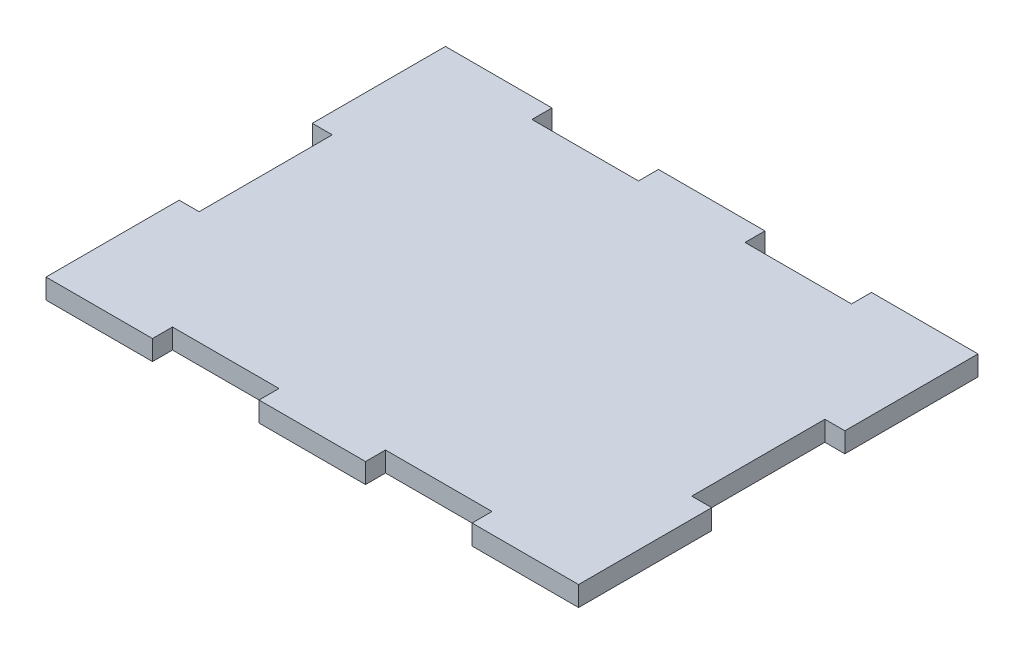
ISO-10303-21;
HEADER;
FILE_DESCRIPTION(('STEP AP214'),'2;1');
FILE_NAME('part.step','',(''),(''),'','','');
FILE_SCHEMA(('AUTOMOTIVE_DESIGN { 1 0 10303 214 1 1 1 1 }'));
ENDSEC;
DATA;
#1=APPLICATION_CONTEXT('core data for automotive mechanical design processes');
#2=APPLICATION_PROTOCOL_DEFINITION('international standard','automotive_design',2000,#1);
#3=PRODUCT_CONTEXT('',#1,'mechanical');
#4=PRODUCT('Part','Part','',(#3));
#5=PRODUCT_RELATED_PRODUCT_CATEGORY('part','',(#4));
#6=PRODUCT_DEFINITION_FORMATION('','',#4);
#7=PRODUCT_DEFINITION_CONTEXT('part definition',#1,'design');
#8=PRODUCT_DEFINITION('design','',#6,#7);
#9=PRODUCT_DEFINITION_SHAPE('','',#8);
#10=(LENGTH_UNIT() NAMED_UNIT(*) SI_UNIT(.MILLI.,.METRE.));
#11=(NAMED_UNIT(*) PLANE_ANGLE_UNIT() SI_UNIT($,.RADIAN.));
#12=(NAMED_UNIT(*) SI_UNIT($,.STERADIAN.) SOLID_ANGLE_UNIT());
#13=UNCERTAINTY_MEASURE_WITH_UNIT(LENGTH_MEASURE(1.E-05),#10,'distance_accuracy_value','');
#14=(GEOMETRIC_REPRESENTATION_CONTEXT(3) GLOBAL_UNCERTAINTY_ASSIGNED_CONTEXT((#13)) GLOBAL_UNIT_ASSIGNED_CONTEXT((#10,
#11,#12)) REPRESENTATION_CONTEXT('',''));
#15=CARTESIAN_POINT('',(0.,0.,0.));
#16=DIRECTION('',(0.,0.,1.));
#17=DIRECTION('',(1.,0.,0.));
#18=AXIS2_PLACEMENT_3D('',#15,#16,#17);
#19=CARTESIAN_POINT('',(0.,3.,0.));
#20=DIRECTION('',(1.,0.,0.));
#21=DIRECTION('',(0.,0.,-1.));
#22=AXIS2_PLACEMENT_3D('',#19,#20,#21);
#23=PLANE('',#22);
#24=DIRECTION('',(0.,0.,1.));
#25=VECTOR('',#24,1.);
#26=CARTESIAN_POINT('',(0.,0.,0.));
#27=LINE('',#26,#25);
#28=CARTESIAN_POINT('',(0.,0.,-20.));
#29=VERTEX_POINT('',#28);
#30=CARTESIAN_POINT('',(0.,0.,0.));
#31=VERTEX_POINT('',#30);
#32=EDGE_CURVE('E248',#29,#31,#27,.T.);
#33=ORIENTED_EDGE('',*,*,#32,.T.);
#34=DIRECTION('',(0.,-1.,0.));
#35=VECTOR('',#34,1.);
#36=CARTESIAN_POINT('',(0.,3.,0.));
#37=LINE('',#36,#35);
#38=CARTESIAN_POINT('',(0.,3.,0.));
#39=VERTEX_POINT('',#38);
#40=EDGE_CURVE('E11',#39,#31,#37,.T.);
#41=ORIENTED_EDGE('',*,*,#40,.F.);
#42=DIRECTION('',(0.,0.,1.));
#43=VECTOR('',#42,1.);
#44=CARTESIAN_POINT('',(0.,3.,0.));
#45=LINE('',#44,#43);
#46=CARTESIAN_POINT('',(0.,3.,-20.));
#47=VERTEX_POINT('',#46);
#48=EDGE_CURVE('E302',#47,#39,#45,.T.);
#49=ORIENTED_EDGE('',*,*,#48,.F.);
#50=DIRECTION('',(0.,-1.,0.));
#51=VECTOR('',#50,1.);
#52=CARTESIAN_POINT('',(0.,3.,-20.));
#53=LINE('',#52,#51);
#54=EDGE_CURVE('E244',#47,#29,#53,.T.);
#55=ORIENTED_EDGE('',*,*,#54,.T.);
#56=EDGE_LOOP('',(#33,#41,#49,#55));
#57=FACE_BOUND('',#56,.T.);
#58=ADVANCED_FACE('F32',(#57),#23,.F.);
#59=CARTESIAN_POINT('',(0.,3.,0.));
#60=DIRECTION('',(0.,0.,-1.));
#61=DIRECTION('',(-1.,0.,0.));
#62=AXIS2_PLACEMENT_3D('',#59,#60,#61);
#63=PLANE('',#62);
#64=DIRECTION('',(1.,0.,0.));
#65=VECTOR('',#64,1.);
#66=CARTESIAN_POINT('',(0.,0.,0.));
#67=LINE('',#66,#65);
#68=CARTESIAN_POINT('',(16.,0.,0.));
#69=VERTEX_POINT('',#68);
#70=EDGE_CURVE('E251',#31,#69,#67,.T.);
#71=ORIENTED_EDGE('',*,*,#70,.T.);
#72=DIRECTION('',(0.,-1.,0.));
#73=VECTOR('',#72,1.);
#74=CARTESIAN_POINT('',(16.,3.,0.));
#75=LINE('',#74,#73);
#76=CARTESIAN_POINT('',(16.,3.,0.));
#77=VERTEX_POINT('',#76);
#78=EDGE_CURVE('E40',#77,#69,#75,.T.);
#79=ORIENTED_EDGE('',*,*,#78,.F.);
#80=DIRECTION('',(1.,0.,0.));
#81=VECTOR('',#80,1.);
#82=CARTESIAN_POINT('',(0.,3.,0.));
#83=LINE('',#82,#81);
#84=EDGE_CURVE('E151',#39,#77,#83,.T.);
#85=ORIENTED_EDGE('',*,*,#84,.F.);
#86=ORIENTED_EDGE('',*,*,#40,.T.);
#87=EDGE_LOOP('',(#71,#79,#85,#86));
#88=FACE_BOUND('',#87,.T.);
#89=ADVANCED_FACE('F460',(#88),#63,.F.);
#90=CARTESIAN_POINT('',(16.,3.,0.));
#91=DIRECTION('',(-1.,0.,0.));
#92=DIRECTION('',(0.,0.,1.));
#93=AXIS2_PLACEMENT_3D('',#90,#91,#92);
#94=PLANE('',#93);
#95=DIRECTION('',(0.,0.,-1.));
#96=VECTOR('',#95,1.);
#97=CARTESIAN_POINT('',(16.,0.,0.));
#98=LINE('',#97,#96);
#99=CARTESIAN_POINT('',(16.,0.,-3.));
#100=VERTEX_POINT('',#99);
#101=EDGE_CURVE('E253',#69,#100,#98,.T.);
#102=ORIENTED_EDGE('',*,*,#101,.T.);
#103=DIRECTION('',(0.,-1.,0.));
#104=VECTOR('',#103,1.);
#105=CARTESIAN_POINT('',(16.,3.,-3.));
#106=LINE('',#105,#104);
#107=CARTESIAN_POINT('',(16.,3.,-3.));
#108=VERTEX_POINT('',#107);
#109=EDGE_CURVE('E369',#108,#100,#106,.T.);
#110=ORIENTED_EDGE('',*,*,#109,.F.);
#111=DIRECTION('',(0.,0.,-1.));
#112=VECTOR('',#111,1.);
#113=CARTESIAN_POINT('',(16.,3.,0.));
#114=LINE('',#113,#112);
#115=EDGE_CURVE('E377',#77,#108,#114,.T.);
#116=ORIENTED_EDGE('',*,*,#115,.F.);
#117=ORIENTED_EDGE('',*,*,#78,.T.);
#118=EDGE_LOOP('',(#102,#110,#116,#117));
#119=FACE_BOUND('',#118,.T.);
#120=ADVANCED_FACE('F375',(#119),#94,.F.);
#121=CARTESIAN_POINT('',(16.,3.,-3.));
#122=DIRECTION('',(0.,0.,-1.));
#123=DIRECTION('',(-1.,0.,0.));
#124=AXIS2_PLACEMENT_3D('',#121,#122,#123);
#125=PLANE('',#124);
#126=DIRECTION('',(1.,0.,0.));
#127=VECTOR('',#126,1.);
#128=CARTESIAN_POINT('',(16.,0.,-3.));
#129=LINE('',#128,#127);
#130=CARTESIAN_POINT('',(32.,0.,-3.));
#131=VERTEX_POINT('',#130);
#132=EDGE_CURVE('E255',#100,#131,#129,.T.);
#133=ORIENTED_EDGE('',*,*,#132,.T.);
#134=DIRECTION('',(0.,-1.,0.));
#135=VECTOR('',#134,1.);
#136=CARTESIAN_POINT('',(32.,3.,-3.));
#137=LINE('',#136,#135);
#138=CARTESIAN_POINT('',(32.,3.,-3.));
#139=VERTEX_POINT('',#138);
#140=EDGE_CURVE('E366',#139,#131,#137,.T.);
#141=ORIENTED_EDGE('',*,*,#140,.F.);
#142=DIRECTION('',(1.,0.,0.));
#143=VECTOR('',#142,1.);
#144=CARTESIAN_POINT('',(16.,3.,-3.));
#145=LINE('',#144,#143);
#146=EDGE_CURVE('E395',#108,#139,#145,.T.);
#147=ORIENTED_EDGE('',*,*,#146,.F.);
#148=ORIENTED_EDGE('',*,*,#109,.T.);
#149=EDGE_LOOP('',(#133,#141,#147,#148));
#150=FACE_BOUND('',#149,.T.);
#151=ADVANCED_FACE('F386',(#150),#125,.F.);
#152=CARTESIAN_POINT('',(32.,3.,0.));
#153=DIRECTION('',(1.,0.,0.));
#154=DIRECTION('',(0.,0.,-1.));
#155=AXIS2_PLACEMENT_3D('',#152,#153,#154);
#156=PLANE('',#155);
#157=DIRECTION('',(0.,0.,1.));
#158=VECTOR('',#157,1.);
#159=CARTESIAN_POINT('',(32.,0.,0.));
#160=LINE('',#159,#158);
#161=CARTESIAN_POINT('',(32.,0.,0.));
#162=VERTEX_POINT('',#161);
#163=EDGE_CURVE('E257',#131,#162,#160,.T.);
#164=ORIENTED_EDGE('',*,*,#163,.T.);
#165=DIRECTION('',(0.,-1.,0.));
#166=VECTOR('',#165,1.);
#167=CARTESIAN_POINT('',(32.,3.,0.));
#168=LINE('',#167,#166);
#169=CARTESIAN_POINT('',(32.,3.,0.));
#170=VERTEX_POINT('',#169);
#171=EDGE_CURVE('E363',#170,#162,#168,.T.);
#172=ORIENTED_EDGE('',*,*,#171,.F.);
#173=DIRECTION('',(0.,0.,1.));
#174=VECTOR('',#173,1.);
#175=CARTESIAN_POINT('',(32.,3.,0.));
#176=LINE('',#175,#174);
#177=EDGE_CURVE('E392',#139,#170,#176,.T.);
#178=ORIENTED_EDGE('',*,*,#177,.F.);
#179=ORIENTED_EDGE('',*,*,#140,.T.);
#180=EDGE_LOOP('',(#164,#172,#178,#179));
#181=FACE_BOUND('',#180,.T.);
#182=ADVANCED_FACE('F390',(#181),#156,.F.);
#183=CARTESIAN_POINT('',(32.,3.,0.));
#184=DIRECTION('',(0.,0.,-1.));
#185=DIRECTION('',(-1.,0.,0.));
#186=AXIS2_PLACEMENT_3D('',#183,#184,#185);
#187=PLANE('',#186);
#188=DIRECTION('',(1.,0.,0.));
#189=VECTOR('',#188,1.);
#190=CARTESIAN_POINT('',(32.,0.,0.));
#191=LINE('',#190,#189);
#192=CARTESIAN_POINT('',(48.,0.,0.));
#193=VERTEX_POINT('',#192);
#194=EDGE_CURVE('E259',#162,#193,#191,.T.);
#195=ORIENTED_EDGE('',*,*,#194,.T.);
#196=DIRECTION('',(0.,-1.,0.));
#197=VECTOR('',#196,1.);
#198=CARTESIAN_POINT('',(48.,3.,0.));
#199=LINE('',#198,#197);
#200=CARTESIAN_POINT('',(48.,3.,0.));
#201=VERTEX_POINT('',#200);
#202=EDGE_CURVE('E360',#201,#193,#199,.T.);
#203=ORIENTED_EDGE('',*,*,#202,.F.);
#204=DIRECTION('',(1.,0.,0.));
#205=VECTOR('',#204,1.);
#206=CARTESIAN_POINT('',(32.,3.,0.));
#207=LINE('',#206,#205);
#208=EDGE_CURVE('E394',#170,#201,#207,.T.);
#209=ORIENTED_EDGE('',*,*,#208,.F.);
#210=ORIENTED_EDGE('',*,*,#171,.T.);
#211=EDGE_LOOP('',(#195,#203,#209,#210));
#212=FACE_BOUND('',#211,.T.);
#213=ADVANCED_FACE('F473',(#212),#187,.F.);
#214=CARTESIAN_POINT('',(48.,3.,0.));
#215=DIRECTION('',(-1.,0.,0.));
#216=DIRECTION('',(0.,0.,1.));
#217=AXIS2_PLACEMENT_3D('',#214,#215,#216);
#218=PLANE('',#217);
#219=DIRECTION('',(0.,0.,-1.));
#220=VECTOR('',#219,1.);
#221=CARTESIAN_POINT('',(48.,0.,0.));
#222=LINE('',#221,#220);
#223=CARTESIAN_POINT('',(48.,0.,-3.));
#224=VERTEX_POINT('',#223);
#225=EDGE_CURVE('E261',#193,#224,#222,.T.);
#226=ORIENTED_EDGE('',*,*,#225,.T.);
#227=DIRECTION('',(0.,-1.,0.));
#228=VECTOR('',#227,1.);
#229=CARTESIAN_POINT('',(48.,3.,-3.));
#230=LINE('',#229,#228);
#231=CARTESIAN_POINT('',(48.,3.,-3.));
#232=VERTEX_POINT('',#231);
#233=EDGE_CURVE('E357',#232,#224,#230,.T.);
#234=ORIENTED_EDGE('',*,*,#233,.F.);
#235=DIRECTION('',(0.,0.,-1.));
#236=VECTOR('',#235,1.);
#237=CARTESIAN_POINT('',(48.,3.,0.));
#238=LINE('',#237,#236);
#239=EDGE_CURVE('E397',#201,#232,#238,.T.);
#240=ORIENTED_EDGE('',*,*,#239,.F.);
#241=ORIENTED_EDGE('',*,*,#202,.T.);
#242=EDGE_LOOP('',(#226,#234,#240,#241));
#243=FACE_BOUND('',#242,.T.);
#244=ADVANCED_FACE('F476',(#243),#218,.F.);
#245=CARTESIAN_POINT('',(48.,3.,-3.));
#246=DIRECTION('',(0.,0.,-1.));
#247=DIRECTION('',(-1.,0.,0.));
#248=AXIS2_PLACEMENT_3D('',#245,#246,#247);
#249=PLANE('',#248);
#250=DIRECTION('',(1.,0.,0.));
#251=VECTOR('',#250,1.);
#252=CARTESIAN_POINT('',(48.,0.,-3.));
#253=LINE('',#252,#251);
#254=CARTESIAN_POINT('',(64.,0.,-3.));
#255=VERTEX_POINT('',#254);
#256=EDGE_CURVE('E263',#224,#255,#253,.T.);
#257=ORIENTED_EDGE('',*,*,#256,.T.);
#258=DIRECTION('',(0.,-1.,0.));
#259=VECTOR('',#258,1.);
#260=CARTESIAN_POINT('',(64.,3.,-3.));
#261=LINE('',#260,#259);
#262=CARTESIAN_POINT('',(64.,3.,-3.));
#263=VERTEX_POINT('',#262);
#264=EDGE_CURVE('E354',#263,#255,#261,.T.);
#265=ORIENTED_EDGE('',*,*,#264,.F.);
#266=DIRECTION('',(1.,0.,0.));
#267=VECTOR('',#266,1.);
#268=CARTESIAN_POINT('',(48.,3.,-3.));
#269=LINE('',#268,#267);
#270=EDGE_CURVE('E403',#232,#263,#269,.T.);
#271=ORIENTED_EDGE('',*,*,#270,.F.);
#272=ORIENTED_EDGE('',*,*,#233,.T.);
#273=EDGE_LOOP('',(#257,#265,#271,#272));
#274=FACE_BOUND('',#273,.T.);
#275=ADVANCED_FACE('F480',(#274),#249,.F.);
#276=CARTESIAN_POINT('',(64.,3.,0.));
#277=DIRECTION('',(1.,0.,0.));
#278=DIRECTION('',(0.,0.,-1.));
#279=AXIS2_PLACEMENT_3D('',#276,#277,#278);
#280=PLANE('',#279);
#281=DIRECTION('',(0.,0.,1.));
#282=VECTOR('',#281,1.);
#283=CARTESIAN_POINT('',(64.,0.,0.));
#284=LINE('',#283,#282);
#285=CARTESIAN_POINT('',(64.,0.,0.));
#286=VERTEX_POINT('',#285);
#287=EDGE_CURVE('E265',#255,#286,#284,.T.);
#288=ORIENTED_EDGE('',*,*,#287,.T.);
#289=DIRECTION('',(0.,-1.,0.));
#290=VECTOR('',#289,1.);
#291=CARTESIAN_POINT('',(64.,3.,0.));
#292=LINE('',#291,#290);
#293=CARTESIAN_POINT('',(64.,3.,0.));
#294=VERTEX_POINT('',#293);
#295=EDGE_CURVE('E351',#294,#286,#292,.T.);
#296=ORIENTED_EDGE('',*,*,#295,.F.);
#297=DIRECTION('',(0.,0.,1.));
#298=VECTOR('',#297,1.);
#299=CARTESIAN_POINT('',(64.,3.,0.));
#300=LINE('',#299,#298);
#301=EDGE_CURVE('E405',#263,#294,#300,.T.);
#302=ORIENTED_EDGE('',*,*,#301,.F.);
#303=ORIENTED_EDGE('',*,*,#264,.T.);
#304=EDGE_LOOP('',(#288,#296,#302,#303));
#305=FACE_BOUND('',#304,.T.);
#306=ADVANCED_FACE('F484',(#305),#280,.F.);
#307=CARTESIAN_POINT('',(64.,3.,0.));
#308=DIRECTION('',(0.,0.,-1.));
#309=DIRECTION('',(-1.,0.,0.));
#310=AXIS2_PLACEMENT_3D('',#307,#308,#309);
#311=PLANE('',#310);
#312=DIRECTION('',(1.,0.,0.));
#313=VECTOR('',#312,1.);
#314=CARTESIAN_POINT('',(64.,0.,0.));
#315=LINE('',#314,#313);
#316=CARTESIAN_POINT('',(80.,0.,0.));
#317=VERTEX_POINT('',#316);
#318=EDGE_CURVE('E267',#286,#317,#315,.T.);
#319=ORIENTED_EDGE('',*,*,#318,.T.);
#320=DIRECTION('',(0.,-1.,0.));
#321=VECTOR('',#320,1.);
#322=CARTESIAN_POINT('',(80.,3.,0.));
#323=LINE('',#322,#321);
#324=CARTESIAN_POINT('',(80.,3.,0.));
#325=VERTEX_POINT('',#324);
#326=EDGE_CURVE('E348',#325,#317,#323,.T.);
#327=ORIENTED_EDGE('',*,*,#326,.F.);
#328=DIRECTION('',(1.,0.,0.));
#329=VECTOR('',#328,1.);
#330=CARTESIAN_POINT('',(64.,3.,0.));
#331=LINE('',#330,#329);
#332=EDGE_CURVE('E407',#294,#325,#331,.T.);
#333=ORIENTED_EDGE('',*,*,#332,.F.);
#334=ORIENTED_EDGE('',*,*,#295,.T.);
#335=EDGE_LOOP('',(#319,#327,#333,#334));
#336=FACE_BOUND('',#335,.T.);
#337=ADVANCED_FACE('F488',(#336),#311,.F.);
#338=CARTESIAN_POINT('',(80.,3.,0.));
#339=DIRECTION('',(-1.,0.,0.));
#340=DIRECTION('',(0.,0.,1.));
#341=AXIS2_PLACEMENT_3D('',#338,#339,#340);
#342=PLANE('',#341);
#343=DIRECTION('',(0.,0.,-1.));
#344=VECTOR('',#343,1.);
#345=CARTESIAN_POINT('',(80.,0.,0.));
#346=LINE('',#345,#344);
#347=CARTESIAN_POINT('',(80.,0.,-20.));
#348=VERTEX_POINT('',#347);
#349=EDGE_CURVE('E269',#317,#348,#346,.T.);
#350=ORIENTED_EDGE('',*,*,#349,.T.);
#351=DIRECTION('',(0.,-1.,0.));
#352=VECTOR('',#351,1.);
#353=CARTESIAN_POINT('',(80.,3.,-20.));
#354=LINE('',#353,#352);
#355=CARTESIAN_POINT('',(80.,3.,-20.));
#356=VERTEX_POINT('',#355);
#357=EDGE_CURVE('E345',#356,#348,#354,.T.);
#358=ORIENTED_EDGE('',*,*,#357,.F.);
#359=DIRECTION('',(0.,0.,-1.));
#360=VECTOR('',#359,1.);
#361=CARTESIAN_POINT('',(80.,3.,0.));
#362=LINE('',#361,#360);
#363=EDGE_CURVE('E409',#325,#356,#362,.T.);
#364=ORIENTED_EDGE('',*,*,#363,.F.);
#365=ORIENTED_EDGE('',*,*,#326,.T.);
#366=EDGE_LOOP('',(#350,#358,#364,#365));
#367=FACE_BOUND('',#366,.T.);
#368=ADVANCED_FACE('F492',(#367),#342,.F.);
#369=CARTESIAN_POINT('',(80.,3.,-20.));
#370=DIRECTION('',(0.,0.,1.));
#371=DIRECTION('',(1.,0.,0.));
#372=AXIS2_PLACEMENT_3D('',#369,#370,#371);
#373=PLANE('',#372);
#374=DIRECTION('',(-1.,0.,0.));
#375=VECTOR('',#374,1.);
#376=CARTESIAN_POINT('',(80.,0.,-20.));
#377=LINE('',#376,#375);
#378=CARTESIAN_POINT('',(77.,0.,-20.));
#379=VERTEX_POINT('',#378);
#380=EDGE_CURVE('E271',#348,#379,#377,.T.);
#381=ORIENTED_EDGE('',*,*,#380,.T.);
#382=DIRECTION('',(0.,-1.,0.));
#383=VECTOR('',#382,1.);
#384=CARTESIAN_POINT('',(77.,3.,-20.));
#385=LINE('',#384,#383);
#386=CARTESIAN_POINT('',(77.,3.,-20.));
#387=VERTEX_POINT('',#386);
#388=EDGE_CURVE('E342',#387,#379,#385,.T.);
#389=ORIENTED_EDGE('',*,*,#388,.F.);
#390=DIRECTION('',(-1.,0.,0.));
#391=VECTOR('',#390,1.);
#392=CARTESIAN_POINT('',(80.,3.,-20.));
#393=LINE('',#392,#391);
#394=EDGE_CURVE('E411',#356,#387,#393,.T.);
#395=ORIENTED_EDGE('',*,*,#394,.F.);
#396=ORIENTED_EDGE('',*,*,#357,.T.);
#397=EDGE_LOOP('',(#381,#389,#395,#396));
#398=FACE_BOUND('',#397,.T.);
#399=ADVANCED_FACE('F496',(#398),#373,.F.);
#400=CARTESIAN_POINT('',(77.,3.,-40.));
#401=DIRECTION('',(-1.,0.,0.));
#402=DIRECTION('',(0.,0.,1.));
#403=AXIS2_PLACEMENT_3D('',#400,#401,#402);
#404=PLANE('',#403);
#405=DIRECTION('',(0.,0.,-1.));
#406=VECTOR('',#405,1.);
#407=CARTESIAN_POINT('',(77.,0.,-40.));
#408=LINE('',#407,#406);
#409=CARTESIAN_POINT('',(77.,0.,-40.));
#410=VERTEX_POINT('',#409);
#411=EDGE_CURVE('E273',#379,#410,#408,.T.);
#412=ORIENTED_EDGE('',*,*,#411,.T.);
#413=DIRECTION('',(0.,-1.,0.));
#414=VECTOR('',#413,1.);
#415=CARTESIAN_POINT('',(77.,3.,-40.));
#416=LINE('',#415,#414);
#417=CARTESIAN_POINT('',(77.,3.,-40.));
#418=VERTEX_POINT('',#417);
#419=EDGE_CURVE('E339',#418,#410,#416,.T.);
#420=ORIENTED_EDGE('',*,*,#419,.F.);
#421=DIRECTION('',(0.,0.,-1.));
#422=VECTOR('',#421,1.);
#423=CARTESIAN_POINT('',(77.,3.,-40.));
#424=LINE('',#423,#422);
#425=EDGE_CURVE('E413',#387,#418,#424,.T.);
#426=ORIENTED_EDGE('',*,*,#425,.F.);
#427=ORIENTED_EDGE('',*,*,#388,.T.);
#428=EDGE_LOOP('',(#412,#420,#426,#427));
#429=FACE_BOUND('',#428,.T.);
#430=ADVANCED_FACE('F500',(#429),#404,.F.);
#431=CARTESIAN_POINT('',(80.,3.,-40.));
#432=DIRECTION('',(0.,0.,-1.));
#433=DIRECTION('',(-1.,0.,0.));
#434=AXIS2_PLACEMENT_3D('',#431,#432,#433);
#435=PLANE('',#434);
#436=DIRECTION('',(1.,0.,0.));
#437=VECTOR('',#436,1.);
#438=CARTESIAN_POINT('',(80.,0.,-40.));
#439=LINE('',#438,#437);
#440=CARTESIAN_POINT('',(80.,0.,-40.));
#441=VERTEX_POINT('',#440);
#442=EDGE_CURVE('E275',#410,#441,#439,.T.);
#443=ORIENTED_EDGE('',*,*,#442,.T.);
#444=DIRECTION('',(0.,-1.,0.));
#445=VECTOR('',#444,1.);
#446=CARTESIAN_POINT('',(80.,3.,-40.));
#447=LINE('',#446,#445);
#448=CARTESIAN_POINT('',(80.,3.,-40.));
#449=VERTEX_POINT('',#448);
#450=EDGE_CURVE('E336',#449,#441,#447,.T.);
#451=ORIENTED_EDGE('',*,*,#450,.F.);
#452=DIRECTION('',(1.,0.,0.));
#453=VECTOR('',#452,1.);
#454=CARTESIAN_POINT('',(80.,3.,-40.));
#455=LINE('',#454,#453);
#456=EDGE_CURVE('E415',#418,#449,#455,.T.);
#457=ORIENTED_EDGE('',*,*,#456,.F.);
#458=ORIENTED_EDGE('',*,*,#419,.T.);
#459=EDGE_LOOP('',(#443,#451,#457,#458));
#460=FACE_BOUND('',#459,.T.);
#461=ADVANCED_FACE('F504',(#460),#435,.F.);
#462=CARTESIAN_POINT('',(80.,3.,-40.));
#463=DIRECTION('',(-1.,0.,0.));
#464=DIRECTION('',(0.,0.,1.));
#465=AXIS2_PLACEMENT_3D('',#462,#463,#464);
#466=PLANE('',#465);
#467=DIRECTION('',(0.,0.,-1.));
#468=VECTOR('',#467,1.);
#469=CARTESIAN_POINT('',(80.,0.,-40.));
#470=LINE('',#469,#468);
#471=CARTESIAN_POINT('',(80.,0.,-60.));
#472=VERTEX_POINT('',#471);
#473=EDGE_CURVE('E277',#441,#472,#470,.T.);
#474=ORIENTED_EDGE('',*,*,#473,.T.);
#475=DIRECTION('',(0.,-1.,0.));
#476=VECTOR('',#475,1.);
#477=CARTESIAN_POINT('',(80.,3.,-60.));
#478=LINE('',#477,#476);
#479=CARTESIAN_POINT('',(80.,3.,-60.));
#480=VERTEX_POINT('',#479);
#481=EDGE_CURVE('E333',#480,#472,#478,.T.);
#482=ORIENTED_EDGE('',*,*,#481,.F.);
#483=DIRECTION('',(0.,0.,-1.));
#484=VECTOR('',#483,1.);
#485=CARTESIAN_POINT('',(80.,3.,-40.));
#486=LINE('',#485,#484);
#487=EDGE_CURVE('E417',#449,#480,#486,.T.);
#488=ORIENTED_EDGE('',*,*,#487,.F.);
#489=ORIENTED_EDGE('',*,*,#450,.T.);
#490=EDGE_LOOP('',(#474,#482,#488,#489));
#491=FACE_BOUND('',#490,.T.);
#492=ADVANCED_FACE('F508',(#491),#466,.F.);
#493=CARTESIAN_POINT('',(64.,3.,-60.));
#494=DIRECTION('',(0.,0.,1.));
#495=DIRECTION('',(1.,0.,0.));
#496=AXIS2_PLACEMENT_3D('',#493,#494,#495);
#497=PLANE('',#496);
#498=DIRECTION('',(-1.,0.,0.));
#499=VECTOR('',#498,1.);
#500=CARTESIAN_POINT('',(64.,0.,-60.));
#501=LINE('',#500,#499);
#502=CARTESIAN_POINT('',(64.,0.,-60.));
#503=VERTEX_POINT('',#502);
#504=EDGE_CURVE('E279',#472,#503,#501,.T.);
#505=ORIENTED_EDGE('',*,*,#504,.T.);
#506=DIRECTION('',(0.,-1.,0.));
#507=VECTOR('',#506,1.);
#508=CARTESIAN_POINT('',(64.,3.,-60.));
#509=LINE('',#508,#507);
#510=CARTESIAN_POINT('',(64.,3.,-60.));
#511=VERTEX_POINT('',#510);
#512=EDGE_CURVE('E330',#511,#503,#509,.T.);
#513=ORIENTED_EDGE('',*,*,#512,.F.);
#514=DIRECTION('',(-1.,0.,0.));
#515=VECTOR('',#514,1.);
#516=CARTESIAN_POINT('',(64.,3.,-60.));
#517=LINE('',#516,#515);
#518=EDGE_CURVE('E419',#480,#511,#517,.T.);
#519=ORIENTED_EDGE('',*,*,#518,.F.);
#520=ORIENTED_EDGE('',*,*,#481,.T.);
#521=EDGE_LOOP('',(#505,#513,#519,#520));
#522=FACE_BOUND('',#521,.T.);
#523=ADVANCED_FACE('F512',(#522),#497,.F.);
#524=CARTESIAN_POINT('',(64.,3.,-60.));
#525=DIRECTION('',(1.,0.,0.));
#526=DIRECTION('',(0.,0.,-1.));
#527=AXIS2_PLACEMENT_3D('',#524,#525,#526);
#528=PLANE('',#527);
#529=DIRECTION('',(0.,0.,1.));
#530=VECTOR('',#529,1.);
#531=CARTESIAN_POINT('',(64.,0.,-60.));
#532=LINE('',#531,#530);
#533=CARTESIAN_POINT('',(64.,0.,-57.));
#534=VERTEX_POINT('',#533);
#535=EDGE_CURVE('E281',#503,#534,#532,.T.);
#536=ORIENTED_EDGE('',*,*,#535,.T.);
#537=DIRECTION('',(0.,-1.,0.));
#538=VECTOR('',#537,1.);
#539=CARTESIAN_POINT('',(64.,3.,-57.));
#540=LINE('',#539,#538);
#541=CARTESIAN_POINT('',(64.,3.,-57.));
#542=VERTEX_POINT('',#541);
#543=EDGE_CURVE('E327',#542,#534,#540,.T.);
#544=ORIENTED_EDGE('',*,*,#543,.F.);
#545=DIRECTION('',(0.,0.,1.));
#546=VECTOR('',#545,1.);
#547=CARTESIAN_POINT('',(64.,3.,-60.));
#548=LINE('',#547,#546);
#549=EDGE_CURVE('E421',#511,#542,#548,.T.);
#550=ORIENTED_EDGE('',*,*,#549,.F.);
#551=ORIENTED_EDGE('',*,*,#512,.T.);
#552=EDGE_LOOP('',(#536,#544,#550,#551));
#553=FACE_BOUND('',#552,.T.);
#554=ADVANCED_FACE('F516',(#553),#528,.F.);
#555=CARTESIAN_POINT('',(48.,3.,-57.));
#556=DIRECTION('',(0.,0.,1.));
#557=DIRECTION('',(1.,0.,0.));
#558=AXIS2_PLACEMENT_3D('',#555,#556,#557);
#559=PLANE('',#558);
#560=DIRECTION('',(-1.,0.,0.));
#561=VECTOR('',#560,1.);
#562=CARTESIAN_POINT('',(48.,0.,-57.));
#563=LINE('',#562,#561);
#564=CARTESIAN_POINT('',(48.,0.,-57.));
#565=VERTEX_POINT('',#564);
#566=EDGE_CURVE('E283',#534,#565,#563,.T.);
#567=ORIENTED_EDGE('',*,*,#566,.T.);
#568=DIRECTION('',(0.,-1.,0.));
#569=VECTOR('',#568,1.);
#570=CARTESIAN_POINT('',(48.,3.,-57.));
#571=LINE('',#570,#569);
#572=CARTESIAN_POINT('',(48.,3.,-57.));
#573=VERTEX_POINT('',#572);
#574=EDGE_CURVE('E324',#573,#565,#571,.T.);
#575=ORIENTED_EDGE('',*,*,#574,.F.);
#576=DIRECTION('',(-1.,0.,0.));
#577=VECTOR('',#576,1.);
#578=CARTESIAN_POINT('',(48.,3.,-57.));
#579=LINE('',#578,#577);
#580=EDGE_CURVE('E423',#542,#573,#579,.T.);
#581=ORIENTED_EDGE('',*,*,#580,.F.);
#582=ORIENTED_EDGE('',*,*,#543,.T.);
#583=EDGE_LOOP('',(#567,#575,#581,#582));
#584=FACE_BOUND('',#583,.T.);
#585=ADVANCED_FACE('F520',(#584),#559,.F.);
#586=CARTESIAN_POINT('',(48.,3.,-60.));
#587=DIRECTION('',(-1.,0.,0.));
#588=DIRECTION('',(0.,0.,1.));
#589=AXIS2_PLACEMENT_3D('',#586,#587,#588);
#590=PLANE('',#589);
#591=DIRECTION('',(0.,0.,-1.));
#592=VECTOR('',#591,1.);
#593=CARTESIAN_POINT('',(48.,0.,-60.));
#594=LINE('',#593,#592);
#595=CARTESIAN_POINT('',(48.,0.,-60.));
#596=VERTEX_POINT('',#595);
#597=EDGE_CURVE('E285',#565,#596,#594,.T.);
#598=ORIENTED_EDGE('',*,*,#597,.T.);
#599=DIRECTION('',(0.,-1.,0.));
#600=VECTOR('',#599,1.);
#601=CARTESIAN_POINT('',(48.,3.,-60.));
#602=LINE('',#601,#600);
#603=CARTESIAN_POINT('',(48.,3.,-60.));
#604=VERTEX_POINT('',#603);
#605=EDGE_CURVE('E321',#604,#596,#602,.T.);
#606=ORIENTED_EDGE('',*,*,#605,.F.);
#607=DIRECTION('',(0.,0.,-1.));
#608=VECTOR('',#607,1.);
#609=CARTESIAN_POINT('',(48.,3.,-60.));
#610=LINE('',#609,#608);
#611=EDGE_CURVE('E425',#573,#604,#610,.T.);
#612=ORIENTED_EDGE('',*,*,#611,.F.);
#613=ORIENTED_EDGE('',*,*,#574,.T.);
#614=EDGE_LOOP('',(#598,#606,#612,#613));
#615=FACE_BOUND('',#614,.T.);
#616=ADVANCED_FACE('F524',(#615),#590,.F.);
#617=CARTESIAN_POINT('',(32.,3.,-60.));
#618=DIRECTION('',(0.,0.,1.));
#619=DIRECTION('',(1.,0.,0.));
#620=AXIS2_PLACEMENT_3D('',#617,#618,#619);
#621=PLANE('',#620);
#622=DIRECTION('',(-1.,0.,0.));
#623=VECTOR('',#622,1.);
#624=CARTESIAN_POINT('',(32.,0.,-60.));
#625=LINE('',#624,#623);
#626=CARTESIAN_POINT('',(32.,0.,-60.));
#627=VERTEX_POINT('',#626);
#628=EDGE_CURVE('E287',#596,#627,#625,.T.);
#629=ORIENTED_EDGE('',*,*,#628,.T.);
#630=DIRECTION('',(0.,-1.,0.));
#631=VECTOR('',#630,1.);
#632=CARTESIAN_POINT('',(32.,3.,-60.));
#633=LINE('',#632,#631);
#634=CARTESIAN_POINT('',(32.,3.,-60.));
#635=VERTEX_POINT('',#634);
#636=EDGE_CURVE('E318',#635,#627,#633,.T.);
#637=ORIENTED_EDGE('',*,*,#636,.F.);
#638=DIRECTION('',(-1.,0.,0.));
#639=VECTOR('',#638,1.);
#640=CARTESIAN_POINT('',(32.,3.,-60.));
#641=LINE('',#640,#639);
#642=EDGE_CURVE('E427',#604,#635,#641,.T.);
#643=ORIENTED_EDGE('',*,*,#642,.F.);
#644=ORIENTED_EDGE('',*,*,#605,.T.);
#645=EDGE_LOOP('',(#629,#637,#643,#644));
#646=FACE_BOUND('',#645,.T.);
#647=ADVANCED_FACE('F528',(#646),#621,.F.);
#648=CARTESIAN_POINT('',(32.,3.,-60.));
#649=DIRECTION('',(1.,0.,0.));
#650=DIRECTION('',(0.,0.,-1.));
#651=AXIS2_PLACEMENT_3D('',#648,#649,#650);
#652=PLANE('',#651);
#653=DIRECTION('',(0.,0.,1.));
#654=VECTOR('',#653,1.);
#655=CARTESIAN_POINT('',(32.,0.,-60.));
#656=LINE('',#655,#654);
#657=CARTESIAN_POINT('',(32.,0.,-57.));
#658=VERTEX_POINT('',#657);
#659=EDGE_CURVE('E289',#627,#658,#656,.T.);
#660=ORIENTED_EDGE('',*,*,#659,.T.);
#661=DIRECTION('',(0.,-1.,0.));
#662=VECTOR('',#661,1.);
#663=CARTESIAN_POINT('',(32.,3.,-57.));
#664=LINE('',#663,#662);
#665=CARTESIAN_POINT('',(32.,3.,-57.));
#666=VERTEX_POINT('',#665);
#667=EDGE_CURVE('E315',#666,#658,#664,.T.);
#668=ORIENTED_EDGE('',*,*,#667,.F.);
#669=DIRECTION('',(0.,0.,1.));
#670=VECTOR('',#669,1.);
#671=CARTESIAN_POINT('',(32.,3.,-60.));
#672=LINE('',#671,#670);
#673=EDGE_CURVE('E429',#635,#666,#672,.T.);
#674=ORIENTED_EDGE('',*,*,#673,.F.);
#675=ORIENTED_EDGE('',*,*,#636,.T.);
#676=EDGE_LOOP('',(#660,#668,#674,#675));
#677=FACE_BOUND('',#676,.T.);
#678=ADVANCED_FACE('F532',(#677),#652,.F.);
#679=CARTESIAN_POINT('',(16.,3.,-57.));
#680=DIRECTION('',(0.,0.,1.));
#681=DIRECTION('',(1.,0.,0.));
#682=AXIS2_PLACEMENT_3D('',#679,#680,#681);
#683=PLANE('',#682);
#684=DIRECTION('',(-1.,0.,0.));
#685=VECTOR('',#684,1.);
#686=CARTESIAN_POINT('',(16.,0.,-57.));
#687=LINE('',#686,#685);
#688=CARTESIAN_POINT('',(16.,0.,-57.));
#689=VERTEX_POINT('',#688);
#690=EDGE_CURVE('E291',#658,#689,#687,.T.);
#691=ORIENTED_EDGE('',*,*,#690,.T.);
#692=DIRECTION('',(0.,-1.,0.));
#693=VECTOR('',#692,1.);
#694=CARTESIAN_POINT('',(16.,3.,-57.));
#695=LINE('',#694,#693);
#696=CARTESIAN_POINT('',(16.,3.,-57.));
#697=VERTEX_POINT('',#696);
#698=EDGE_CURVE('E312',#697,#689,#695,.T.);
#699=ORIENTED_EDGE('',*,*,#698,.F.);
#700=DIRECTION('',(-1.,0.,0.));
#701=VECTOR('',#700,1.);
#702=CARTESIAN_POINT('',(16.,3.,-57.));
#703=LINE('',#702,#701);
#704=EDGE_CURVE('E431',#666,#697,#703,.T.);
#705=ORIENTED_EDGE('',*,*,#704,.F.);
#706=ORIENTED_EDGE('',*,*,#667,.T.);
#707=EDGE_LOOP('',(#691,#699,#705,#706));
#708=FACE_BOUND('',#707,.T.);
#709=ADVANCED_FACE('F536',(#708),#683,.F.);
#710=CARTESIAN_POINT('',(16.,3.,-60.));
#711=DIRECTION('',(-1.,0.,0.));
#712=DIRECTION('',(0.,0.,1.));
#713=AXIS2_PLACEMENT_3D('',#710,#711,#712);
#714=PLANE('',#713);
#715=DIRECTION('',(0.,0.,-1.));
#716=VECTOR('',#715,1.);
#717=CARTESIAN_POINT('',(16.,0.,-60.));
#718=LINE('',#717,#716);
#719=CARTESIAN_POINT('',(16.,0.,-60.));
#720=VERTEX_POINT('',#719);
#721=EDGE_CURVE('E293',#689,#720,#718,.T.);
#722=ORIENTED_EDGE('',*,*,#721,.T.);
#723=DIRECTION('',(0.,-1.,0.));
#724=VECTOR('',#723,1.);
#725=CARTESIAN_POINT('',(16.,3.,-60.));
#726=LINE('',#725,#724);
#727=CARTESIAN_POINT('',(16.,3.,-60.));
#728=VERTEX_POINT('',#727);
#729=EDGE_CURVE('E309',#728,#720,#726,.T.);
#730=ORIENTED_EDGE('',*,*,#729,.F.);
#731=DIRECTION('',(0.,0.,-1.));
#732=VECTOR('',#731,1.);
#733=CARTESIAN_POINT('',(16.,3.,-60.));
#734=LINE('',#733,#732);
#735=EDGE_CURVE('E433',#697,#728,#734,.T.);
#736=ORIENTED_EDGE('',*,*,#735,.F.);
#737=ORIENTED_EDGE('',*,*,#698,.T.);
#738=EDGE_LOOP('',(#722,#730,#736,#737));
#739=FACE_BOUND('',#738,.T.);
#740=ADVANCED_FACE('F540',(#739),#714,.F.);
#741=CARTESIAN_POINT('',(0.,3.,-60.));
#742=DIRECTION('',(0.,0.,1.));
#743=DIRECTION('',(1.,0.,0.));
#744=AXIS2_PLACEMENT_3D('',#741,#742,#743);
#745=PLANE('',#744);
#746=DIRECTION('',(-1.,0.,0.));
#747=VECTOR('',#746,1.);
#748=CARTESIAN_POINT('',(0.,0.,-60.));
#749=LINE('',#748,#747);
#750=CARTESIAN_POINT('',(0.,0.,-60.));
#751=VERTEX_POINT('',#750);
#752=EDGE_CURVE('E295',#720,#751,#749,.T.);
#753=ORIENTED_EDGE('',*,*,#752,.T.);
#754=DIRECTION('',(0.,-1.,0.));
#755=VECTOR('',#754,1.);
#756=CARTESIAN_POINT('',(0.,3.,-60.));
#757=LINE('',#756,#755);
#758=CARTESIAN_POINT('',(0.,3.,-60.));
#759=VERTEX_POINT('',#758);
#760=EDGE_CURVE('E306',#759,#751,#757,.T.);
#761=ORIENTED_EDGE('',*,*,#760,.F.);
#762=DIRECTION('',(-1.,0.,0.));
#763=VECTOR('',#762,1.);
#764=CARTESIAN_POINT('',(0.,3.,-60.));
#765=LINE('',#764,#763);
#766=EDGE_CURVE('E435',#728,#759,#765,.T.);
#767=ORIENTED_EDGE('',*,*,#766,.F.);
#768=ORIENTED_EDGE('',*,*,#729,.T.);
#769=EDGE_LOOP('',(#753,#761,#767,#768));
#770=FACE_BOUND('',#769,.T.);
#771=ADVANCED_FACE('F441',(#770),#745,.F.);
#772=CARTESIAN_POINT('',(0.,3.,-40.));
#773=DIRECTION('',(1.,0.,0.));
#774=DIRECTION('',(0.,0.,-1.));
#775=AXIS2_PLACEMENT_3D('',#772,#773,#774);
#776=PLANE('',#775);
#777=DIRECTION('',(0.,0.,1.));
#778=VECTOR('',#777,1.);
#779=CARTESIAN_POINT('',(0.,0.,-40.));
#780=LINE('',#779,#778);
#781=CARTESIAN_POINT('',(0.,0.,-40.));
#782=VERTEX_POINT('',#781);
#783=EDGE_CURVE('E297',#751,#782,#780,.T.);
#784=ORIENTED_EDGE('',*,*,#783,.T.);
#785=DIRECTION('',(0.,-1.,0.));
#786=VECTOR('',#785,1.);
#787=CARTESIAN_POINT('',(0.,3.,-40.));
#788=LINE('',#787,#786);
#789=CARTESIAN_POINT('',(0.,3.,-40.));
#790=VERTEX_POINT('',#789);
#791=EDGE_CURVE('E239',#790,#782,#788,.T.);
#792=ORIENTED_EDGE('',*,*,#791,.F.);
#793=DIRECTION('',(0.,0.,1.));
#794=VECTOR('',#793,1.);
#795=CARTESIAN_POINT('',(0.,3.,-40.));
#796=LINE('',#795,#794);
#797=EDGE_CURVE('E230',#759,#790,#796,.T.);
#798=ORIENTED_EDGE('',*,*,#797,.F.);
#799=ORIENTED_EDGE('',*,*,#760,.T.);
#800=EDGE_LOOP('',(#784,#792,#798,#799));
#801=FACE_BOUND('',#800,.T.);
#802=ADVANCED_FACE('F445',(#801),#776,.F.);
#803=CARTESIAN_POINT('',(0.,3.,-40.));
#804=DIRECTION('',(0.,0.,-1.));
#805=DIRECTION('',(-1.,0.,0.));
#806=AXIS2_PLACEMENT_3D('',#803,#804,#805);
#807=PLANE('',#806);
#808=DIRECTION('',(1.,0.,0.));
#809=VECTOR('',#808,1.);
#810=CARTESIAN_POINT('',(0.,0.,-40.));
#811=LINE('',#810,#809);
#812=CARTESIAN_POINT('',(3.,0.,-40.));
#813=VERTEX_POINT('',#812);
#814=EDGE_CURVE('E238',#782,#813,#811,.T.);
#815=ORIENTED_EDGE('',*,*,#814,.T.);
#816=DIRECTION('',(0.,-1.,0.));
#817=VECTOR('',#816,1.);
#818=CARTESIAN_POINT('',(3.,3.,-40.));
#819=LINE('',#818,#817);
#820=CARTESIAN_POINT('',(3.,3.,-40.));
#821=VERTEX_POINT('',#820);
#822=EDGE_CURVE('E235',#821,#813,#819,.T.);
#823=ORIENTED_EDGE('',*,*,#822,.F.);
#824=DIRECTION('',(1.,0.,0.));
#825=VECTOR('',#824,1.);
#826=CARTESIAN_POINT('',(0.,3.,-40.));
#827=LINE('',#826,#825);
#828=EDGE_CURVE('E224',#790,#821,#827,.T.);
#829=ORIENTED_EDGE('',*,*,#828,.F.);
#830=ORIENTED_EDGE('',*,*,#791,.T.);
#831=EDGE_LOOP('',(#815,#823,#829,#830));
#832=FACE_BOUND('',#831,.T.);
#833=ADVANCED_FACE('F236',(#832),#807,.F.);
#834=CARTESIAN_POINT('',(3.,3.,-40.));
#835=DIRECTION('',(1.,0.,0.));
#836=DIRECTION('',(0.,0.,-1.));
#837=AXIS2_PLACEMENT_3D('',#834,#835,#836);
#838=PLANE('',#837);
#839=DIRECTION('',(0.,0.,1.));
#840=VECTOR('',#839,1.);
#841=CARTESIAN_POINT('',(3.,0.,-40.));
#842=LINE('',#841,#840);
#843=CARTESIAN_POINT('',(3.,0.,-20.));
#844=VERTEX_POINT('',#843);
#845=EDGE_CURVE('E137',#813,#844,#842,.T.);
#846=ORIENTED_EDGE('',*,*,#845,.T.);
#847=DIRECTION('',(0.,-1.,0.));
#848=VECTOR('',#847,1.);
#849=CARTESIAN_POINT('',(3.,3.,-20.));
#850=LINE('',#849,#848);
#851=CARTESIAN_POINT('',(3.,3.,-20.));
#852=VERTEX_POINT('',#851);
#853=EDGE_CURVE('E240',#852,#844,#850,.T.);
#854=ORIENTED_EDGE('',*,*,#853,.F.);
#855=DIRECTION('',(0.,0.,1.));
#856=VECTOR('',#855,1.);
#857=CARTESIAN_POINT('',(3.,3.,-40.));
#858=LINE('',#857,#856);
#859=EDGE_CURVE('E228',#821,#852,#858,.T.);
#860=ORIENTED_EDGE('',*,*,#859,.F.);
#861=ORIENTED_EDGE('',*,*,#822,.T.);
#862=EDGE_LOOP('',(#846,#854,#860,#861));
#863=FACE_BOUND('',#862,.T.);
#864=ADVANCED_FACE('F242',(#863),#838,.F.);
#865=CARTESIAN_POINT('',(0.,3.,-20.));
#866=DIRECTION('',(0.,0.,1.));
#867=DIRECTION('',(1.,0.,0.));
#868=AXIS2_PLACEMENT_3D('',#865,#866,#867);
#869=PLANE('',#868);
#870=DIRECTION('',(-1.,0.,0.));
#871=VECTOR('',#870,1.);
#872=CARTESIAN_POINT('',(0.,0.,-20.));
#873=LINE('',#872,#871);
#874=EDGE_CURVE('E143',#844,#29,#873,.T.);
#875=ORIENTED_EDGE('',*,*,#874,.T.);
#876=ORIENTED_EDGE('',*,*,#54,.F.);
#877=DIRECTION('',(-1.,0.,0.));
#878=VECTOR('',#877,1.);
#879=CARTESIAN_POINT('',(0.,3.,-20.));
#880=LINE('',#879,#878);
#881=EDGE_CURVE('E48',#852,#47,#880,.T.);
#882=ORIENTED_EDGE('',*,*,#881,.F.);
#883=ORIENTED_EDGE('',*,*,#853,.T.);
#884=EDGE_LOOP('',(#875,#876,#882,#883));
#885=FACE_BOUND('',#884,.T.);
#886=ADVANCED_FACE('F449',(#885),#869,.F.);
#887=CARTESIAN_POINT('',(0.,3.,0.));
#888=DIRECTION('',(0.,-1.,0.));
#889=DIRECTION('',(0.,0.,-1.));
#890=AXIS2_PLACEMENT_3D('',#887,#888,#889);
#891=PLANE('',#890);
#892=ORIENTED_EDGE('',*,*,#48,.T.);
#893=ORIENTED_EDGE('',*,*,#84,.T.);
#894=ORIENTED_EDGE('',*,*,#115,.T.);
#895=ORIENTED_EDGE('',*,*,#146,.T.);
#896=ORIENTED_EDGE('',*,*,#177,.T.);
#897=ORIENTED_EDGE('',*,*,#208,.T.);
#898=ORIENTED_EDGE('',*,*,#239,.T.);
#899=ORIENTED_EDGE('',*,*,#270,.T.);
#900=ORIENTED_EDGE('',*,*,#301,.T.);
#901=ORIENTED_EDGE('',*,*,#332,.T.);
#902=ORIENTED_EDGE('',*,*,#363,.T.);
#903=ORIENTED_EDGE('',*,*,#394,.T.);
#904=ORIENTED_EDGE('',*,*,#425,.T.);
#905=ORIENTED_EDGE('',*,*,#456,.T.);
#906=ORIENTED_EDGE('',*,*,#487,.T.);
#907=ORIENTED_EDGE('',*,*,#518,.T.);
#908=ORIENTED_EDGE('',*,*,#549,.T.);
#909=ORIENTED_EDGE('',*,*,#580,.T.);
#910=ORIENTED_EDGE('',*,*,#611,.T.);
#911=ORIENTED_EDGE('',*,*,#642,.T.);
#912=ORIENTED_EDGE('',*,*,#673,.T.);
#913=ORIENTED_EDGE('',*,*,#704,.T.);
#914=ORIENTED_EDGE('',*,*,#735,.T.);
#915=ORIENTED_EDGE('',*,*,#766,.T.);
#916=ORIENTED_EDGE('',*,*,#797,.T.);
#917=ORIENTED_EDGE('',*,*,#828,.T.);
#918=ORIENTED_EDGE('',*,*,#859,.T.);
#919=ORIENTED_EDGE('',*,*,#881,.T.);
#920=EDGE_LOOP('',(#892,#893,#894,#895,#896,#897,#898,#899,#900,#901,#902,#903,#904,#905,#906,
#907,#908,#909,#910,#911,#912,#913,#914,#915,#916,#917,#918,#919));
#921=FACE_BOUND('',#920,.T.);
#922=ADVANCED_FACE('F226',(#921),#891,.F.);
#923=CARTESIAN_POINT('',(0.,0.,0.));
#924=DIRECTION('',(0.,-1.,0.));
#925=DIRECTION('',(0.,0.,-1.));
#926=AXIS2_PLACEMENT_3D('',#923,#924,#925);
#927=PLANE('',#926);
#928=ORIENTED_EDGE('',*,*,#32,.F.);
#929=ORIENTED_EDGE('',*,*,#874,.F.);
#930=ORIENTED_EDGE('',*,*,#845,.F.);
#931=ORIENTED_EDGE('',*,*,#814,.F.);
#932=ORIENTED_EDGE('',*,*,#783,.F.);
#933=ORIENTED_EDGE('',*,*,#752,.F.);
#934=ORIENTED_EDGE('',*,*,#721,.F.);
#935=ORIENTED_EDGE('',*,*,#690,.F.);
#936=ORIENTED_EDGE('',*,*,#659,.F.);
#937=ORIENTED_EDGE('',*,*,#628,.F.);
#938=ORIENTED_EDGE('',*,*,#597,.F.);
#939=ORIENTED_EDGE('',*,*,#566,.F.);
#940=ORIENTED_EDGE('',*,*,#535,.F.);
#941=ORIENTED_EDGE('',*,*,#504,.F.);
#942=ORIENTED_EDGE('',*,*,#473,.F.);
#943=ORIENTED_EDGE('',*,*,#442,.F.);
#944=ORIENTED_EDGE('',*,*,#411,.F.);
#945=ORIENTED_EDGE('',*,*,#380,.F.);
#946=ORIENTED_EDGE('',*,*,#349,.F.);
#947=ORIENTED_EDGE('',*,*,#318,.F.);
#948=ORIENTED_EDGE('',*,*,#287,.F.);
#949=ORIENTED_EDGE('',*,*,#256,.F.);
#950=ORIENTED_EDGE('',*,*,#225,.F.);
#951=ORIENTED_EDGE('',*,*,#194,.F.);
#952=ORIENTED_EDGE('',*,*,#163,.F.);
#953=ORIENTED_EDGE('',*,*,#132,.F.);
#954=ORIENTED_EDGE('',*,*,#101,.F.);
#955=ORIENTED_EDGE('',*,*,#70,.F.);
#956=EDGE_LOOP('',(#928,#929,#930,#931,#932,#933,#934,#935,#936,#937,#938,#939,#940,#941,#942,
#943,#944,#945,#946,#947,#948,#949,#950,#951,#952,#953,#954,#955));
#957=FACE_BOUND('',#956,.T.);
#958=ADVANCED_FACE('F381',(#957),#927,.T.);
#959=CLOSED_SHELL('',(#58,#89,#120,#151,#182,#213,#244,#275,#306,#337,#368,#399,#430,#461,#492,
#523,#554,#585,#616,#647,#678,#709,#740,#771,#802,#833,#864,#886,#922,#958));
#960=MANIFOLD_SOLID_BREP('B2',#959);
#961=ADVANCED_BREP_SHAPE_REPRESENTATION('',(#18,#960),#14);
#962=SHAPE_DEFINITION_REPRESENTATION(#9,#961);
ENDSEC;
END-ISO-10303-21;
